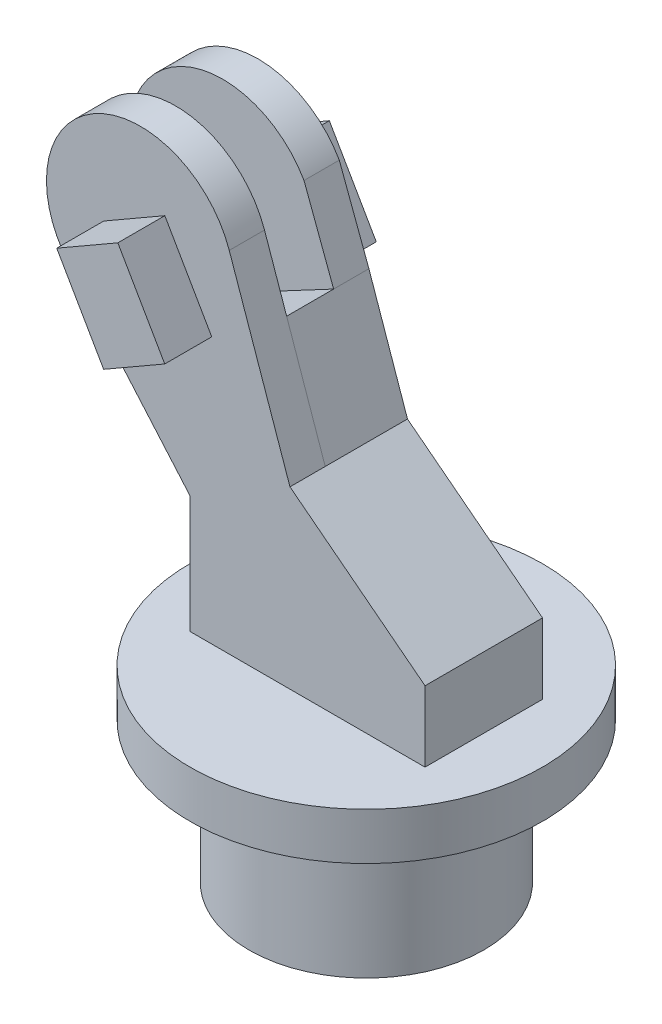
ISO-10303-21;
HEADER;
FILE_DESCRIPTION(('STEP AP214'),'2;1');
FILE_NAME('part.step','',(''),(''),'','','');
FILE_SCHEMA(('AUTOMOTIVE_DESIGN { 1 0 10303 214 1 1 1 1 }'));
ENDSEC;
DATA;
#1=APPLICATION_CONTEXT('core data for automotive mechanical design processes');
#2=APPLICATION_PROTOCOL_DEFINITION('international standard','automotive_design',2000,#1);
#3=PRODUCT_CONTEXT('',#1,'mechanical');
#4=PRODUCT('Part','Part','',(#3));
#5=PRODUCT_RELATED_PRODUCT_CATEGORY('part','',(#4));
#6=PRODUCT_DEFINITION_FORMATION('','',#4);
#7=PRODUCT_DEFINITION_CONTEXT('part definition',#1,'design');
#8=PRODUCT_DEFINITION('design','',#6,#7);
#9=PRODUCT_DEFINITION_SHAPE('','',#8);
#10=(LENGTH_UNIT() NAMED_UNIT(*) SI_UNIT(.MILLI.,.METRE.));
#11=(NAMED_UNIT(*) PLANE_ANGLE_UNIT() SI_UNIT($,.RADIAN.));
#12=(NAMED_UNIT(*) SI_UNIT($,.STERADIAN.) SOLID_ANGLE_UNIT());
#13=UNCERTAINTY_MEASURE_WITH_UNIT(LENGTH_MEASURE(1.E-05),#10,'distance_accuracy_value','');
#14=(GEOMETRIC_REPRESENTATION_CONTEXT(3) GLOBAL_UNCERTAINTY_ASSIGNED_CONTEXT((#13)) GLOBAL_UNIT_ASSIGNED_CONTEXT((#10,
#11,#12)) REPRESENTATION_CONTEXT('',''));
#15=CARTESIAN_POINT('',(0.,0.,0.));
#16=DIRECTION('',(0.,0.,1.));
#17=DIRECTION('',(1.,0.,0.));
#18=AXIS2_PLACEMENT_3D('',#15,#16,#17);
#19=CARTESIAN_POINT('',(0.,0.,38.1));
#20=DIRECTION('',(0.,0.,1.));
#21=DIRECTION('',(1.,0.,0.));
#22=AXIS2_PLACEMENT_3D('',#19,#20,#21);
#23=PLANE('',#22);
#24=DIRECTION('',(0.653512064631514,-0.75691609930101,0.));
#25=VECTOR('',#24,1.);
#26=CARTESIAN_POINT('',(-48.0641723056141,-41.4980161041011,38.1));
#27=LINE('',#26,#25);
#28=CARTESIAN_POINT('',(-178.502675688983,109.579536282436,38.1));
#29=VERTEX_POINT('',#28);
#30=CARTESIAN_POINT('',(-48.0641723056141,-41.4980161041011,38.1));
#31=VERTEX_POINT('',#30);
#32=EDGE_CURVE('E457',#29,#31,#27,.T.);
#33=ORIENTED_EDGE('',*,*,#32,.T.);
#34=DIRECTION('',(0.,-1.,0.));
#35=VECTOR('',#34,1.);
#36=CARTESIAN_POINT('',(-48.0641723056141,-41.4980161041011,38.1));
#37=LINE('',#36,#35);
#38=CARTESIAN_POINT('',(-48.0641723056141,-168.498016104101,38.1));
#39=VERTEX_POINT('',#38);
#40=EDGE_CURVE('E390',#31,#39,#37,.T.);
#41=ORIENTED_EDGE('',*,*,#40,.T.);
#42=DIRECTION('',(1.,0.,0.));
#43=VECTOR('',#42,1.);
#44=CARTESIAN_POINT('',(-48.0641723056141,-168.498016104101,38.1));
#45=LINE('',#44,#43);
#46=CARTESIAN_POINT('',(205.935827694386,-168.498016104101,38.1));
#47=VERTEX_POINT('',#46);
#48=EDGE_CURVE('E415',#39,#47,#45,.T.);
#49=ORIENTED_EDGE('',*,*,#48,.T.);
#50=DIRECTION('',(0.,1.,0.));
#51=VECTOR('',#50,1.);
#52=CARTESIAN_POINT('',(205.935827694386,-168.498016104101,38.1));
#53=LINE('',#52,#51);
#54=CARTESIAN_POINT('',(205.935827694386,-92.2980161041011,38.1));
#55=VERTEX_POINT('',#54);
#56=EDGE_CURVE('E418',#47,#55,#53,.T.);
#57=ORIENTED_EDGE('',*,*,#56,.T.);
#58=DIRECTION('',(-0.790282353034111,0.612742851841511,0.));
#59=VECTOR('',#58,1.);
#60=CARTESIAN_POINT('',(205.935827694386,-92.2980161041011,38.1));
#61=LINE('',#60,#59);
#62=CARTESIAN_POINT('',(59.9704223056142,20.8757861764843,38.1));
#63=VERTEX_POINT('',#62);
#64=EDGE_CURVE('E395',#55,#63,#61,.T.);
#65=ORIENTED_EDGE('',*,*,#64,.T.);
#66=DIRECTION('',(0.32875253821235,-0.944416099301011,0.));
#67=VECTOR('',#66,1.);
#68=CARTESIAN_POINT('',(59.9704223056142,20.8757861764842,38.1));
#69=LINE('',#68,#67);
#70=CARTESIAN_POINT('',(-5.64732431101803,209.377619931372,38.1));
#71=VERTEX_POINT('',#70);
#72=EDGE_CURVE('E453',#71,#63,#69,.T.);
#73=ORIENTED_EDGE('',*,*,#72,.F.);
#74=CARTESIAN_POINT('',(-101.600000000001,175.976362048997,38.1));
#75=DIRECTION('',(0.,0.,1.));
#76=DIRECTION('',(1.,0.,0.));
#77=AXIS2_PLACEMENT_3D('',#74,#75,#76);
#78=CIRCLE('',#77,101.6);
#79=EDGE_CURVE('E445',#71,#29,#78,.T.);
#80=ORIENTED_EDGE('',*,*,#79,.T.);
#81=EDGE_LOOP('',(#33,#41,#49,#57,#65,#73,#80));
#82=FACE_BOUND('',#81,.T.);
#83=DIRECTION('',(-0.49903870108268,0.866579699059302,0.));
#84=VECTOR('',#83,1.);
#85=CARTESIAN_POINT('',(-24.5648809807227,119.003650496163,38.1));
#86=LINE('',#85,#84);
#87=CARTESIAN_POINT('',(-24.5648809807227,119.003650496163,38.1));
#88=VERTEX_POINT('',#87);
#89=CARTESIAN_POINT('',(-75.267213010723,207.048147920588,38.1));
#90=VERTEX_POINT('',#89);
#91=EDGE_CURVE('E269',#88,#90,#86,.T.);
#92=ORIENTED_EDGE('',*,*,#91,.F.);
#93=DIRECTION('',(0.866579699059302,0.499038701082681,0.));
#94=VECTOR('',#93,1.);
#95=CARTESIAN_POINT('',(-24.5648809807227,119.003650496163,38.1));
#96=LINE('',#95,#94);
#97=CARTESIAN_POINT('',(-90.5982540490415,80.9769014736625,38.1));
#98=VERTEX_POINT('',#97);
#99=EDGE_CURVE('E210',#98,#88,#96,.T.);
#100=ORIENTED_EDGE('',*,*,#99,.F.);
#101=DIRECTION('',(0.49903870108268,-0.866579699059302,0.));
#102=VECTOR('',#101,1.);
#103=CARTESIAN_POINT('',(-90.5982540490415,80.9769014736625,38.1));
#104=LINE('',#103,#102);
#105=CARTESIAN_POINT('',(-141.300586079042,169.021398898088,38.1));
#106=VERTEX_POINT('',#105);
#107=EDGE_CURVE('E256',#106,#98,#104,.T.);
#108=ORIENTED_EDGE('',*,*,#107,.F.);
#109=DIRECTION('',(-0.866579699059302,-0.499038701082681,0.));
#110=VECTOR('',#109,1.);
#111=CARTESIAN_POINT('',(-75.267213010723,207.048147920588,38.1));
#112=LINE('',#111,#110);
#113=EDGE_CURVE('E272',#90,#106,#112,.T.);
#114=ORIENTED_EDGE('',*,*,#113,.F.);
#115=EDGE_LOOP('',(#92,#100,#108,#114));
#116=FACE_BOUND('',#115,.T.);
#117=ADVANCED_FACE('F41',(#82,#116),#23,.T.);
#118=CARTESIAN_POINT('',(18.2632612343824,140.689049325709,-88.9));
#119=DIRECTION('',(0.46960220053166,-0.882878119139795,0.));
#120=DIRECTION('',(0.882878119139795,0.46960220053166,0.));
#121=AXIS2_PLACEMENT_3D('',#118,#119,#120);
#122=PLANE('',#121);
#123=DIRECTION('',(-0.882878119139795,-0.46960220053166,0.));
#124=VECTOR('',#123,1.);
#125=CARTESIAN_POINT('',(18.2632612343824,140.689049325709,-50.8));
#126=LINE('',#125,#124);
#127=CARTESIAN_POINT('',(18.2632612343824,140.689049325709,-50.8));
#128=VERTEX_POINT('',#127);
#129=CARTESIAN_POINT('',(-134.985164693071,59.1763280526264,-50.8));
#130=VERTEX_POINT('',#129);
#131=EDGE_CURVE('E323',#128,#130,#126,.T.);
#132=ORIENTED_EDGE('',*,*,#131,.T.);
#133=DIRECTION('',(0.,0.,1.));
#134=VECTOR('',#133,1.);
#135=CARTESIAN_POINT('',(-134.985164693071,59.1763280526264,-88.9));
#136=LINE('',#135,#134);
#137=CARTESIAN_POINT('',(-134.985164693071,59.1763280526264,0.));
#138=VERTEX_POINT('',#137);
#139=EDGE_CURVE('E382',#130,#138,#136,.T.);
#140=ORIENTED_EDGE('',*,*,#139,.T.);
#141=DIRECTION('',(0.882878119139795,0.46960220053166,0.));
#142=VECTOR('',#141,1.);
#143=CARTESIAN_POINT('',(18.2632612343824,140.689049325709,0.));
#144=LINE('',#143,#142);
#145=CARTESIAN_POINT('',(18.2632612220155,140.689049361235,0.));
#146=VERTEX_POINT('',#145);
#147=EDGE_CURVE('E368',#138,#146,#144,.T.);
#148=ORIENTED_EDGE('',*,*,#147,.T.);
#149=DIRECTION('',(0.,0.,1.));
#150=VECTOR('',#149,1.);
#151=CARTESIAN_POINT('',(18.2632612343824,140.689049325709,-88.9));
#152=LINE('',#151,#150);
#153=EDGE_CURVE('E377',#128,#146,#152,.T.);
#154=ORIENTED_EDGE('',*,*,#153,.F.);
#155=EDGE_LOOP('',(#132,#140,#148,#154));
#156=FACE_BOUND('',#155,.T.);
#157=ADVANCED_FACE('F533',(#156),#122,.F.);
#158=CARTESIAN_POINT('',(0.,0.,0.));
#159=DIRECTION('',(0.,0.,1.));
#160=DIRECTION('',(1.,0.,0.));
#161=AXIS2_PLACEMENT_3D('',#158,#159,#160);
#162=PLANE('',#161);
#163=CARTESIAN_POINT('',(0.,0.,0.));
#164=DIRECTION('',(0.,0.,-1.));
#165=DIRECTION('',(-1.,0.,0.));
#166=AXIS2_PLACEMENT_3D('',#163,#164,#165);
#167=CIRCLE('',#166,63.5);
#168=CARTESIAN_POINT('',(-48.0641723056141,-41.4980161041011,0.));
#169=VERTEX_POINT('',#168);
#170=CARTESIAN_POINT('',(-51.7738505308691,-36.7657231835201,0.));
#171=VERTEX_POINT('',#170);
#172=EDGE_CURVE('E345',#169,#171,#167,.T.);
#173=ORIENTED_EDGE('',*,*,#172,.F.);
#174=DIRECTION('',(0.653512064631514,-0.75691609930101,0.));
#175=VECTOR('',#174,1.);
#176=CARTESIAN_POINT('',(-48.0641723056141,-41.4980161041011,0.));
#177=LINE('',#176,#175);
#178=EDGE_CURVE('E467',#138,#169,#177,.T.);
#179=ORIENTED_EDGE('',*,*,#178,.F.);
#180=DIRECTION('',(-0.655207198127574,0.755449222331862,0.));
#181=VECTOR('',#180,1.);
#182=CARTESIAN_POINT('',(-51.7738505308691,-36.7657231835201,0.));
#183=LINE('',#182,#181);
#184=EDGE_CURVE('E364',#171,#138,#183,.T.);
#185=ORIENTED_EDGE('',*,*,#184,.F.);
#186=EDGE_LOOP('',(#173,#179,#185));
#187=FACE_BOUND('',#186,.T.);
#188=ADVANCED_FACE('F535',(#187),#162,.F.);
#189=CARTESIAN_POINT('',(-101.600000000001,175.976362048997,0.));
#190=DIRECTION('',(0.,0.,1.));
#191=DIRECTION('',(1.,0.,0.));
#192=AXIS2_PLACEMENT_3D('',#189,#190,#191);
#193=CIRCLE('',#192,12.7);
#194=CARTESIAN_POINT('',(-88.9000000000007,175.976362048997,0.));
#195=VERTEX_POINT('',#194);
#196=EDGE_CURVE('E11',#195,#195,#193,.F.);
#197=ORIENTED_EDGE('',*,*,#196,.F.);
#198=EDGE_LOOP('',(#197));
#199=FACE_BOUND('',#198,.T.);
#200=ORIENTED_EDGE('',*,*,#147,.F.);
#201=CARTESIAN_POINT('',(-178.502675688983,109.579536282436,0.));
#202=VERTEX_POINT('',#201);
#203=EDGE_CURVE('E458',#202,#138,#177,.T.);
#204=ORIENTED_EDGE('',*,*,#203,.F.);
#205=CARTESIAN_POINT('',(-101.600000000001,175.976362048997,0.));
#206=DIRECTION('',(0.,0.,1.));
#207=DIRECTION('',(1.,0.,0.));
#208=AXIS2_PLACEMENT_3D('',#205,#206,#207);
#209=CIRCLE('',#208,101.6);
#210=CARTESIAN_POINT('',(-5.64732431101803,209.377619931372,0.));
#211=VERTEX_POINT('',#210);
#212=EDGE_CURVE('E446',#211,#202,#209,.T.);
#213=ORIENTED_EDGE('',*,*,#212,.F.);
#214=DIRECTION('',(0.32875253821235,-0.944416099301011,0.));
#215=VECTOR('',#214,1.);
#216=CARTESIAN_POINT('',(59.9704223056142,20.8757861764842,0.));
#217=LINE('',#216,#215);
#218=EDGE_CURVE('E463',#211,#146,#217,.T.);
#219=ORIENTED_EDGE('',*,*,#218,.T.);
#220=EDGE_LOOP('',(#200,#204,#213,#219));
#221=FACE_BOUND('',#220,.T.);
#222=ADVANCED_FACE('F530',(#199,#221),#162,.F.);
#223=DIRECTION('',(0.328751469637615,-0.944416471272663,0.));
#224=VECTOR('',#223,1.);
#225=CARTESIAN_POINT('',(60.0146978783595,20.7481574740804,0.));
#226=LINE('',#225,#224);
#227=CARTESIAN_POINT('',(60.0146978783595,20.7481574740804,0.));
#228=VERTEX_POINT('',#227);
#229=EDGE_CURVE('E352',#146,#228,#226,.T.);
#230=ORIENTED_EDGE('',*,*,#229,.F.);
#231=CARTESIAN_POINT('',(59.9704223056142,20.8757861764843,0.));
#232=VERTEX_POINT('',#231);
#233=EDGE_CURVE('E449',#146,#232,#217,.T.);
#234=ORIENTED_EDGE('',*,*,#233,.T.);
#235=CARTESIAN_POINT('',(0.,0.,0.));
#236=DIRECTION('',(0.,0.,1.));
#237=DIRECTION('',(1.,0.,0.));
#238=AXIS2_PLACEMENT_3D('',#235,#236,#237);
#239=CIRCLE('',#238,63.5);
#240=EDGE_CURVE('E428',#228,#232,#239,.T.);
#241=ORIENTED_EDGE('',*,*,#240,.F.);
#242=EDGE_LOOP('',(#230,#234,#241));
#243=FACE_BOUND('',#242,.T.);
#244=ADVANCED_FACE('F523',(#243),#162,.F.);
#245=CARTESIAN_POINT('',(0.,0.,-88.9));
#246=DIRECTION('',(0.,0.,1.));
#247=DIRECTION('',(1.,0.,0.));
#248=AXIS2_PLACEMENT_3D('',#245,#246,#247);
#249=CYLINDRICAL_SURFACE('',#248,63.5);
#250=CARTESIAN_POINT('',(0.,0.,-88.9));
#251=DIRECTION('',(0.,0.,-1.));
#252=DIRECTION('',(1.,0.,0.));
#253=AXIS2_PLACEMENT_3D('',#250,#251,#252);
#254=CIRCLE('',#253,63.5);
#255=CARTESIAN_POINT('',(59.9704223056142,20.8757861764843,-88.9));
#256=VERTEX_POINT('',#255);
#257=CARTESIAN_POINT('',(60.0146978783592,20.7481574740811,-88.9));
#258=VERTEX_POINT('',#257);
#259=EDGE_CURVE('E391',#256,#258,#254,.T.);
#260=ORIENTED_EDGE('',*,*,#259,.T.);
#261=DIRECTION('',(0.,0.,1.));
#262=VECTOR('',#261,1.);
#263=CARTESIAN_POINT('',(60.0146978783595,20.7481574740804,-88.9));
#264=LINE('',#263,#262);
#265=EDGE_CURVE('E360',#258,#228,#264,.T.);
#266=ORIENTED_EDGE('',*,*,#265,.T.);
#267=ORIENTED_EDGE('',*,*,#240,.T.);
#268=DIRECTION('',(0.,0.,1.));
#269=VECTOR('',#268,1.);
#270=CARTESIAN_POINT('',(59.9704223056142,20.8757861764843,-88.9));
#271=LINE('',#270,#269);
#272=EDGE_CURVE('E424',#256,#232,#271,.T.);
#273=ORIENTED_EDGE('',*,*,#272,.F.);
#274=EDGE_LOOP('',(#260,#266,#267,#273));
#275=FACE_BOUND('',#274,.T.);
#276=ADVANCED_FACE('F571',(#275),#249,.F.);
#277=CARTESIAN_POINT('',(59.9704223056142,20.8757861764842,38.1));
#278=DIRECTION('',(0.944416099301011,0.32875253821235,0.));
#279=DIRECTION('',(-0.32875253821235,0.944416099301011,0.));
#280=AXIS2_PLACEMENT_3D('',#277,#278,#279);
#281=PLANE('',#280);
#282=ORIENTED_EDGE('',*,*,#218,.F.);
#283=DIRECTION('',(0.,0.,-1.));
#284=VECTOR('',#283,1.);
#285=CARTESIAN_POINT('',(-5.64732431101803,209.377619931372,38.1));
#286=LINE('',#285,#284);
#287=EDGE_CURVE('E478',#71,#211,#286,.T.);
#288=ORIENTED_EDGE('',*,*,#287,.F.);
#289=ORIENTED_EDGE('',*,*,#72,.T.);
#290=DIRECTION('',(0.,0.,-1.));
#291=VECTOR('',#290,1.);
#292=CARTESIAN_POINT('',(59.9704223056142,20.8757861764843,38.1));
#293=LINE('',#292,#291);
#294=EDGE_CURVE('E306',#63,#232,#293,.T.);
#295=ORIENTED_EDGE('',*,*,#294,.T.);
#296=ORIENTED_EDGE('',*,*,#233,.F.);
#297=EDGE_LOOP('',(#282,#288,#289,#295,#296));
#298=FACE_BOUND('',#297,.T.);
#299=ADVANCED_FACE('F43',(#298),#281,.T.);
#300=CARTESIAN_POINT('',(-48.0641723056141,-41.4980161041011,38.1));
#301=DIRECTION('',(0.75691609930101,0.653512064631514,0.));
#302=DIRECTION('',(-0.653512064631514,0.75691609930101,0.));
#303=AXIS2_PLACEMENT_3D('',#300,#301,#302);
#304=PLANE('',#303);
#305=ORIENTED_EDGE('',*,*,#203,.T.);
#306=ORIENTED_EDGE('',*,*,#178,.T.);
#307=DIRECTION('',(0.,0.,-1.));
#308=VECTOR('',#307,1.);
#309=CARTESIAN_POINT('',(-48.0641723056141,-41.4980161041011,38.1));
#310=LINE('',#309,#308);
#311=EDGE_CURVE('E462',#31,#169,#310,.T.);
#312=ORIENTED_EDGE('',*,*,#311,.F.);
#313=ORIENTED_EDGE('',*,*,#32,.F.);
#314=DIRECTION('',(0.,0.,-1.));
#315=VECTOR('',#314,1.);
#316=CARTESIAN_POINT('',(-178.502675688983,109.579536282436,38.1));
#317=LINE('',#316,#315);
#318=EDGE_CURVE('E474',#29,#202,#317,.T.);
#319=ORIENTED_EDGE('',*,*,#318,.T.);
#320=EDGE_LOOP('',(#305,#306,#312,#313,#319));
#321=FACE_BOUND('',#320,.T.);
#322=ADVANCED_FACE('F576',(#321),#304,.F.);
#323=CARTESIAN_POINT('',(-101.600000000001,175.976362048997,0.));
#324=DIRECTION('',(0.,0.,1.));
#325=DIRECTION('',(1.,0.,0.));
#326=AXIS2_PLACEMENT_3D('',#323,#324,#325);
#327=CYLINDRICAL_SURFACE('',#326,101.6);
#328=ORIENTED_EDGE('',*,*,#287,.T.);
#329=ORIENTED_EDGE('',*,*,#212,.T.);
#330=ORIENTED_EDGE('',*,*,#318,.F.);
#331=ORIENTED_EDGE('',*,*,#79,.F.);
#332=EDGE_LOOP('',(#328,#329,#330,#331));
#333=FACE_BOUND('',#332,.T.);
#334=ADVANCED_FACE('F563',(#333),#327,.T.);
#335=CARTESIAN_POINT('',(205.935827694386,-92.2980161041011,-88.9));
#336=DIRECTION('',(0.612742851841511,0.790282353034111,0.));
#337=DIRECTION('',(-0.790282353034111,0.612742851841511,0.));
#338=AXIS2_PLACEMENT_3D('',#335,#336,#337);
#339=PLANE('',#338);
#340=ORIENTED_EDGE('',*,*,#64,.F.);
#341=DIRECTION('',(0.,0.,1.));
#342=VECTOR('',#341,1.);
#343=CARTESIAN_POINT('',(205.935827694386,-92.2980161041011,-88.9));
#344=LINE('',#343,#342);
#345=CARTESIAN_POINT('',(205.935827694386,-92.2980161041011,-88.9));
#346=VERTEX_POINT('',#345);
#347=EDGE_CURVE('E429',#346,#55,#344,.T.);
#348=ORIENTED_EDGE('',*,*,#347,.F.);
#349=DIRECTION('',(-0.790282353034111,0.612742851841511,0.));
#350=VECTOR('',#349,1.);
#351=CARTESIAN_POINT('',(205.935827694386,-92.2980161041011,-88.9));
#352=LINE('',#351,#350);
#353=EDGE_CURVE('E407',#346,#256,#352,.T.);
#354=ORIENTED_EDGE('',*,*,#353,.T.);
#355=ORIENTED_EDGE('',*,*,#272,.T.);
#356=ORIENTED_EDGE('',*,*,#294,.F.);
#357=EDGE_LOOP('',(#340,#348,#354,#355,#356));
#358=FACE_BOUND('',#357,.T.);
#359=ADVANCED_FACE('F559',(#358),#339,.T.);
#360=CARTESIAN_POINT('',(205.935827694386,-168.498016104101,-88.9));
#361=DIRECTION('',(1.,0.,0.));
#362=DIRECTION('',(0.,0.,-1.));
#363=AXIS2_PLACEMENT_3D('',#360,#361,#362);
#364=PLANE('',#363);
#365=ORIENTED_EDGE('',*,*,#56,.F.);
#366=DIRECTION('',(0.,0.,1.));
#367=VECTOR('',#366,1.);
#368=CARTESIAN_POINT('',(205.935827694386,-168.498016104101,-88.9));
#369=LINE('',#368,#367);
#370=CARTESIAN_POINT('',(205.935827694386,-168.498016104101,-88.9));
#371=VERTEX_POINT('',#370);
#372=EDGE_CURVE('E432',#371,#47,#369,.T.);
#373=ORIENTED_EDGE('',*,*,#372,.F.);
#374=DIRECTION('',(0.,1.,0.));
#375=VECTOR('',#374,1.);
#376=CARTESIAN_POINT('',(205.935827694386,-168.498016104101,-88.9));
#377=LINE('',#376,#375);
#378=EDGE_CURVE('E403',#371,#346,#377,.T.);
#379=ORIENTED_EDGE('',*,*,#378,.T.);
#380=ORIENTED_EDGE('',*,*,#347,.T.);
#381=EDGE_LOOP('',(#365,#373,#379,#380));
#382=FACE_BOUND('',#381,.T.);
#383=ADVANCED_FACE('F562',(#382),#364,.T.);
#384=CARTESIAN_POINT('',(-48.0641723056141,-41.4980161041011,-88.9));
#385=DIRECTION('',(-1.,0.,0.));
#386=DIRECTION('',(0.,-1.,0.));
#387=AXIS2_PLACEMENT_3D('',#384,#385,#386);
#388=PLANE('',#387);
#389=ORIENTED_EDGE('',*,*,#40,.F.);
#390=ORIENTED_EDGE('',*,*,#311,.T.);
#391=DIRECTION('',(0.,0.,1.));
#392=VECTOR('',#391,1.);
#393=CARTESIAN_POINT('',(-48.0641723056141,-41.4980161041011,-88.9));
#394=LINE('',#393,#392);
#395=CARTESIAN_POINT('',(-48.0641723056141,-41.4980161041011,-88.9));
#396=VERTEX_POINT('',#395);
#397=EDGE_CURVE('E411',#396,#169,#394,.T.);
#398=ORIENTED_EDGE('',*,*,#397,.F.);
#399=DIRECTION('',(0.,-1.,0.));
#400=VECTOR('',#399,1.);
#401=CARTESIAN_POINT('',(-48.0641723056141,-41.4980161041011,-88.9));
#402=LINE('',#401,#400);
#403=CARTESIAN_POINT('',(-48.0641723056141,-168.498016104101,-88.9));
#404=VERTEX_POINT('',#403);
#405=EDGE_CURVE('E394',#396,#404,#402,.T.);
#406=ORIENTED_EDGE('',*,*,#405,.T.);
#407=DIRECTION('',(0.,0.,1.));
#408=VECTOR('',#407,1.);
#409=CARTESIAN_POINT('',(-48.0641723056141,-168.498016104101,-88.9));
#410=LINE('',#409,#408);
#411=EDGE_CURVE('E436',#404,#39,#410,.T.);
#412=ORIENTED_EDGE('',*,*,#411,.T.);
#413=EDGE_LOOP('',(#389,#390,#398,#406,#412));
#414=FACE_BOUND('',#413,.T.);
#415=ADVANCED_FACE('F557',(#414),#388,.T.);
#416=CARTESIAN_POINT('',(0.,0.,-88.9));
#417=DIRECTION('',(0.,0.,1.));
#418=DIRECTION('',(1.,0.,0.));
#419=AXIS2_PLACEMENT_3D('',#416,#417,#418);
#420=PLANE('',#419);
#421=DIRECTION('',(0.49903870108268,-0.866579699059302,0.));
#422=VECTOR('',#421,1.);
#423=CARTESIAN_POINT('',(-90.5982540490415,80.9769014736625,-88.9));
#424=LINE('',#423,#422);
#425=CARTESIAN_POINT('',(-141.300586079042,169.021398898088,-88.9));
#426=VERTEX_POINT('',#425);
#427=CARTESIAN_POINT('',(-90.5982540490415,80.9769014736625,-88.9));
#428=VERTEX_POINT('',#427);
#429=EDGE_CURVE('E236',#426,#428,#424,.T.);
#430=ORIENTED_EDGE('',*,*,#429,.T.);
#431=DIRECTION('',(0.866579699059302,0.499038701082681,0.));
#432=VECTOR('',#431,1.);
#433=CARTESIAN_POINT('',(-24.5648809807227,119.003650496163,-88.9));
#434=LINE('',#433,#432);
#435=CARTESIAN_POINT('',(-24.5648809807227,119.003650496163,-88.9));
#436=VERTEX_POINT('',#435);
#437=EDGE_CURVE('E204',#428,#436,#434,.T.);
#438=ORIENTED_EDGE('',*,*,#437,.T.);
#439=DIRECTION('',(-0.49903870108268,0.866579699059302,0.));
#440=VECTOR('',#439,1.);
#441=CARTESIAN_POINT('',(-24.5648809807227,119.003650496163,-88.9));
#442=LINE('',#441,#440);
#443=CARTESIAN_POINT('',(-75.267213010723,207.048147920588,-88.9));
#444=VERTEX_POINT('',#443);
#445=EDGE_CURVE('E222',#436,#444,#442,.T.);
#446=ORIENTED_EDGE('',*,*,#445,.T.);
#447=DIRECTION('',(-0.866579699059302,-0.499038701082681,0.));
#448=VECTOR('',#447,1.);
#449=CARTESIAN_POINT('',(-75.267213010723,207.048147920588,-88.9));
#450=LINE('',#449,#448);
#451=EDGE_CURVE('E57',#444,#426,#450,.T.);
#452=ORIENTED_EDGE('',*,*,#451,.T.);
#453=EDGE_LOOP('',(#430,#438,#446,#452));
#454=FACE_BOUND('',#453,.T.);
#455=ORIENTED_EDGE('',*,*,#259,.F.);
#456=ORIENTED_EDGE('',*,*,#353,.F.);
#457=ORIENTED_EDGE('',*,*,#378,.F.);
#458=DIRECTION('',(1.,0.,0.));
#459=VECTOR('',#458,1.);
#460=CARTESIAN_POINT('',(-48.0641723056141,-168.498016104101,-88.9));
#461=LINE('',#460,#459);
#462=EDGE_CURVE('E399',#404,#371,#461,.T.);
#463=ORIENTED_EDGE('',*,*,#462,.F.);
#464=ORIENTED_EDGE('',*,*,#405,.F.);
#465=CARTESIAN_POINT('',(0.,0.,-88.9));
#466=DIRECTION('',(0.,0.,-1.));
#467=DIRECTION('',(-1.,0.,0.));
#468=AXIS2_PLACEMENT_3D('',#465,#466,#467);
#469=CIRCLE('',#468,63.5);
#470=CARTESIAN_POINT('',(-51.7738505308691,-36.7657231835201,-88.9));
#471=VERTEX_POINT('',#470);
#472=EDGE_CURVE('E348',#396,#471,#469,.T.);
#473=ORIENTED_EDGE('',*,*,#472,.T.);
#474=DIRECTION('',(-0.655207198127574,0.755449222331862,0.));
#475=VECTOR('',#474,1.);
#476=CARTESIAN_POINT('',(-51.7738505308691,-36.7657231835201,-88.9));
#477=LINE('',#476,#475);
#478=CARTESIAN_POINT('',(-134.985164693071,59.1763280526264,-88.9));
#479=VERTEX_POINT('',#478);
#480=EDGE_CURVE('E351',#471,#479,#477,.T.);
#481=ORIENTED_EDGE('',*,*,#480,.T.);
#482=DIRECTION('',(-0.633930637160239,0.773389906366519,0.));
#483=VECTOR('',#482,1.);
#484=CARTESIAN_POINT('',(-134.985164693071,59.1763280526264,-88.9));
#485=LINE('',#484,#483);
#486=CARTESIAN_POINT('',(-189.462961162212,125.638769588913,-88.9));
#487=VERTEX_POINT('',#486);
#488=EDGE_CURVE('E320',#479,#487,#485,.T.);
#489=ORIENTED_EDGE('',*,*,#488,.T.);
#490=CARTESIAN_POINT('',(-101.600000000001,175.976362048997,-88.9));
#491=DIRECTION('',(0.,0.,-1.));
#492=DIRECTION('',(-1.,0.,0.));
#493=AXIS2_PLACEMENT_3D('',#490,#491,#492);
#494=CIRCLE('',#493,101.260916245459);
#495=CARTESIAN_POINT('',(-13.737038837789,226.313954509082,-88.9));
#496=VERTEX_POINT('',#495);
#497=EDGE_CURVE('E311',#487,#496,#494,.T.);
#498=ORIENTED_EDGE('',*,*,#497,.T.);
#499=DIRECTION('',(0.350077418087642,-0.936720770211214,0.));
#500=VECTOR('',#499,1.);
#501=CARTESIAN_POINT('',(-13.737038837789,226.313954509082,-88.9));
#502=LINE('',#501,#500);
#503=CARTESIAN_POINT('',(18.2632612343824,140.689049325709,-88.9));
#504=VERTEX_POINT('',#503);
#505=EDGE_CURVE('E335',#496,#504,#502,.T.);
#506=ORIENTED_EDGE('',*,*,#505,.T.);
#507=DIRECTION('',(0.328751469637615,-0.944416471272663,0.));
#508=VECTOR('',#507,1.);
#509=CARTESIAN_POINT('',(60.0146978783595,20.7481574740804,-88.9));
#510=LINE('',#509,#508);
#511=EDGE_CURVE('E356',#504,#258,#510,.T.);
#512=ORIENTED_EDGE('',*,*,#511,.T.);
#513=EDGE_LOOP('',(#455,#456,#457,#463,#464,#473,#481,#489,#498,#506,#512));
#514=FACE_BOUND('',#513,.T.);
#515=ADVANCED_FACE('F553',(#454,#514),#420,.F.);
#516=CARTESIAN_POINT('',(0.,0.,-88.9));
#517=DIRECTION('',(0.,0.,1.));
#518=DIRECTION('',(1.,0.,0.));
#519=AXIS2_PLACEMENT_3D('',#516,#517,#518);
#520=CYLINDRICAL_SURFACE('',#519,63.5);
#521=ORIENTED_EDGE('',*,*,#397,.T.);
#522=ORIENTED_EDGE('',*,*,#172,.T.);
#523=DIRECTION('',(0.,0.,1.));
#524=VECTOR('',#523,1.);
#525=CARTESIAN_POINT('',(-51.7738505308691,-36.7657231835201,-88.9));
#526=LINE('',#525,#524);
#527=EDGE_CURVE('E386',#471,#171,#526,.T.);
#528=ORIENTED_EDGE('',*,*,#527,.F.);
#529=ORIENTED_EDGE('',*,*,#472,.F.);
#530=EDGE_LOOP('',(#521,#522,#528,#529));
#531=FACE_BOUND('',#530,.T.);
#532=ADVANCED_FACE('F550',(#531),#520,.T.);
#533=CARTESIAN_POINT('',(-51.7738505308691,-36.7657231835201,-88.9));
#534=DIRECTION('',(0.755449222331862,0.655207198127574,0.));
#535=DIRECTION('',(-0.655207198127574,0.755449222331862,0.));
#536=AXIS2_PLACEMENT_3D('',#533,#534,#535);
#537=PLANE('',#536);
#538=ORIENTED_EDGE('',*,*,#184,.T.);
#539=ORIENTED_EDGE('',*,*,#139,.F.);
#540=EDGE_CURVE('E383',#479,#130,#136,.T.);
#541=ORIENTED_EDGE('',*,*,#540,.F.);
#542=ORIENTED_EDGE('',*,*,#480,.F.);
#543=ORIENTED_EDGE('',*,*,#527,.T.);
#544=EDGE_LOOP('',(#538,#539,#541,#542,#543));
#545=FACE_BOUND('',#544,.T.);
#546=ADVANCED_FACE('F508',(#545),#537,.F.);
#547=CARTESIAN_POINT('',(60.0146978783595,20.7481574740804,-88.9));
#548=DIRECTION('',(-0.944416471272663,-0.328751469637615,0.));
#549=DIRECTION('',(0.328751469637615,-0.944416471272663,0.));
#550=AXIS2_PLACEMENT_3D('',#547,#548,#549);
#551=PLANE('',#550);
#552=ORIENTED_EDGE('',*,*,#229,.T.);
#553=ORIENTED_EDGE('',*,*,#265,.F.);
#554=ORIENTED_EDGE('',*,*,#511,.F.);
#555=EDGE_CURVE('E378',#504,#128,#152,.T.);
#556=ORIENTED_EDGE('',*,*,#555,.T.);
#557=ORIENTED_EDGE('',*,*,#153,.T.);
#558=EDGE_LOOP('',(#552,#553,#554,#556,#557));
#559=FACE_BOUND('',#558,.T.);
#560=ADVANCED_FACE('F517',(#559),#551,.F.);
#561=CARTESIAN_POINT('',(-101.600000000001,175.976362048997,-50.8));
#562=DIRECTION('',(0.,0.,-1.));
#563=DIRECTION('',(-1.,0.,0.));
#564=AXIS2_PLACEMENT_3D('',#561,#562,#563);
#565=CYLINDRICAL_SURFACE('',#564,101.260916245459);
#566=ORIENTED_EDGE('',*,*,#497,.F.);
#567=DIRECTION('',(0.,0.,-1.));
#568=VECTOR('',#567,1.);
#569=CARTESIAN_POINT('',(-189.462961162212,125.638769588913,-50.8));
#570=LINE('',#569,#568);
#571=CARTESIAN_POINT('',(-189.462961162212,125.638769588913,-50.8));
#572=VERTEX_POINT('',#571);
#573=EDGE_CURVE('E342',#572,#487,#570,.T.);
#574=ORIENTED_EDGE('',*,*,#573,.F.);
#575=CARTESIAN_POINT('',(-101.600000000001,175.976362048997,-50.8));
#576=DIRECTION('',(0.,0.,-1.));
#577=DIRECTION('',(-1.,0.,0.));
#578=AXIS2_PLACEMENT_3D('',#575,#576,#577);
#579=CIRCLE('',#578,101.260916245459);
#580=CARTESIAN_POINT('',(-13.737038837789,226.313954509082,-50.8));
#581=VERTEX_POINT('',#580);
#582=EDGE_CURVE('E315',#572,#581,#579,.T.);
#583=ORIENTED_EDGE('',*,*,#582,.T.);
#584=DIRECTION('',(0.,0.,-1.));
#585=VECTOR('',#584,1.);
#586=CARTESIAN_POINT('',(-13.737038837789,226.313954509082,-50.8));
#587=LINE('',#586,#585);
#588=EDGE_CURVE('E331',#581,#496,#587,.T.);
#589=ORIENTED_EDGE('',*,*,#588,.T.);
#590=EDGE_LOOP('',(#566,#574,#583,#589));
#591=FACE_BOUND('',#590,.T.);
#592=ADVANCED_FACE('F596',(#591),#565,.T.);
#593=CARTESIAN_POINT('',(-134.985164693071,59.1763280526264,-50.8));
#594=DIRECTION('',(-0.773389906366519,-0.633930637160239,0.));
#595=DIRECTION('',(0.633930637160239,-0.773389906366519,0.));
#596=AXIS2_PLACEMENT_3D('',#593,#594,#595);
#597=PLANE('',#596);
#598=ORIENTED_EDGE('',*,*,#488,.F.);
#599=ORIENTED_EDGE('',*,*,#540,.T.);
#600=DIRECTION('',(-0.633930637160239,0.773389906366519,0.));
#601=VECTOR('',#600,1.);
#602=CARTESIAN_POINT('',(-134.985164693071,59.1763280526264,-50.8));
#603=LINE('',#602,#601);
#604=EDGE_CURVE('E327',#130,#572,#603,.T.);
#605=ORIENTED_EDGE('',*,*,#604,.T.);
#606=ORIENTED_EDGE('',*,*,#573,.T.);
#607=EDGE_LOOP('',(#598,#599,#605,#606));
#608=FACE_BOUND('',#607,.T.);
#609=ADVANCED_FACE('F502',(#608),#597,.T.);
#610=CARTESIAN_POINT('',(-13.737038837789,226.313954509082,-50.8));
#611=DIRECTION('',(0.936720770211214,0.350077418087642,0.));
#612=DIRECTION('',(-0.350077418087642,0.936720770211214,0.));
#613=AXIS2_PLACEMENT_3D('',#610,#611,#612);
#614=PLANE('',#613);
#615=ORIENTED_EDGE('',*,*,#505,.F.);
#616=ORIENTED_EDGE('',*,*,#588,.F.);
#617=DIRECTION('',(0.350077418087642,-0.936720770211214,0.));
#618=VECTOR('',#617,1.);
#619=CARTESIAN_POINT('',(-13.737038837789,226.313954509082,-50.8));
#620=LINE('',#619,#618);
#621=EDGE_CURVE('E319',#581,#128,#620,.T.);
#622=ORIENTED_EDGE('',*,*,#621,.T.);
#623=ORIENTED_EDGE('',*,*,#555,.F.);
#624=EDGE_LOOP('',(#615,#616,#622,#623));
#625=FACE_BOUND('',#624,.T.);
#626=ADVANCED_FACE('F494',(#625),#614,.T.);
#627=CARTESIAN_POINT('',(-101.600000000001,175.976362048997,-50.8));
#628=DIRECTION('',(0.,0.,-1.));
#629=DIRECTION('',(-1.,0.,0.));
#630=AXIS2_PLACEMENT_3D('',#627,#628,#629);
#631=PLANE('',#630);
#632=CARTESIAN_POINT('',(-101.600000000001,175.976362048997,-50.8));
#633=DIRECTION('',(0.,0.,-1.));
#634=DIRECTION('',(-1.,0.,0.));
#635=AXIS2_PLACEMENT_3D('',#632,#633,#634);
#636=CIRCLE('',#635,12.7);
#637=CARTESIAN_POINT('',(-114.300000000001,175.976362048997,-50.8));
#638=VERTEX_POINT('',#637);
#639=EDGE_CURVE('E50',#638,#638,#636,.F.);
#640=ORIENTED_EDGE('',*,*,#639,.F.);
#641=EDGE_LOOP('',(#640));
#642=FACE_BOUND('',#641,.T.);
#643=ORIENTED_EDGE('',*,*,#582,.F.);
#644=ORIENTED_EDGE('',*,*,#604,.F.);
#645=ORIENTED_EDGE('',*,*,#131,.F.);
#646=ORIENTED_EDGE('',*,*,#621,.F.);
#647=EDGE_LOOP('',(#643,#644,#645,#646));
#648=FACE_BOUND('',#647,.T.);
#649=ADVANCED_FACE('F490',(#642,#648),#631,.F.);
#650=CARTESIAN_POINT('',(78.9358276943859,-219.298016104101,-25.4));
#651=DIRECTION('',(0.,1.,0.));
#652=DIRECTION('',(0.,0.,1.));
#653=AXIS2_PLACEMENT_3D('',#650,#651,#652);
#654=CYLINDRICAL_SURFACE('',#653,190.5);
#655=CARTESIAN_POINT('',(78.9358276943859,-219.298016104101,-25.4));
#656=DIRECTION('',(0.,-1.,0.));
#657=DIRECTION('',(0.,0.,-1.));
#658=AXIS2_PLACEMENT_3D('',#655,#656,#657);
#659=CIRCLE('',#658,190.5);
#660=CARTESIAN_POINT('',(78.9358276943859,-219.298016104101,-215.9));
#661=VERTEX_POINT('',#660);
#662=EDGE_CURVE('E307',#661,#661,#659,.T.);
#663=ORIENTED_EDGE('',*,*,#662,.F.);
#664=EDGE_LOOP('',(#663));
#665=FACE_BOUND('',#664,.T.);
#666=CARTESIAN_POINT('',(78.9358276943859,-168.498016104101,-25.4));
#667=DIRECTION('',(0.,-1.,0.));
#668=DIRECTION('',(0.,0.,-1.));
#669=AXIS2_PLACEMENT_3D('',#666,#667,#668);
#670=CIRCLE('',#669,190.5);
#671=CARTESIAN_POINT('',(78.9358276943859,-168.498016104101,-215.9));
#672=VERTEX_POINT('',#671);
#673=EDGE_CURVE('E301',#672,#672,#670,.T.);
#674=ORIENTED_EDGE('',*,*,#673,.T.);
#675=EDGE_LOOP('',(#674));
#676=FACE_BOUND('',#675,.T.);
#677=ADVANCED_FACE('F493',(#665,#676),#654,.T.);
#678=CARTESIAN_POINT('',(78.9358276943859,-219.298016104101,-25.4));
#679=DIRECTION('',(0.,-1.,0.));
#680=DIRECTION('',(0.,0.,-1.));
#681=AXIS2_PLACEMENT_3D('',#678,#679,#680);
#682=PLANE('',#681);
#683=CARTESIAN_POINT('',(78.69207152223,-219.298016104101,-25.7622969745912));
#684=DIRECTION('',(0.,-1.,0.));
#685=DIRECTION('',(0.,0.,-1.));
#686=AXIS2_PLACEMENT_3D('',#683,#684,#685);
#687=CIRCLE('',#686,127.);
#688=CARTESIAN_POINT('',(78.69207152223,-219.298016104101,101.237703025409));
#689=VERTEX_POINT('',#688);
#690=EDGE_CURVE('E302',#689,#689,#687,.T.);
#691=ORIENTED_EDGE('',*,*,#690,.F.);
#692=EDGE_LOOP('',(#691));
#693=FACE_BOUND('',#692,.T.);
#694=ORIENTED_EDGE('',*,*,#662,.T.);
#695=EDGE_LOOP('',(#694));
#696=FACE_BOUND('',#695,.T.);
#697=ADVANCED_FACE('F607',(#693,#696),#682,.T.);
#698=CARTESIAN_POINT('',(78.9358276943859,-168.498016104101,-25.4));
#699=DIRECTION('',(0.,-1.,0.));
#700=DIRECTION('',(0.,0.,-1.));
#701=AXIS2_PLACEMENT_3D('',#698,#699,#700);
#702=PLANE('',#701);
#703=ORIENTED_EDGE('',*,*,#48,.F.);
#704=ORIENTED_EDGE('',*,*,#411,.F.);
#705=ORIENTED_EDGE('',*,*,#462,.T.);
#706=ORIENTED_EDGE('',*,*,#372,.T.);
#707=EDGE_LOOP('',(#703,#704,#705,#706));
#708=FACE_BOUND('',#707,.T.);
#709=ORIENTED_EDGE('',*,*,#673,.F.);
#710=EDGE_LOOP('',(#709));
#711=FACE_BOUND('',#710,.T.);
#712=ADVANCED_FACE('F603',(#708,#711),#702,.F.);
#713=CARTESIAN_POINT('',(78.69207152223,-371.698016104101,-25.7622969745912));
#714=DIRECTION('',(0.,1.,0.));
#715=DIRECTION('',(0.,0.,1.));
#716=AXIS2_PLACEMENT_3D('',#713,#714,#715);
#717=CYLINDRICAL_SURFACE('',#716,127.);
#718=CARTESIAN_POINT('',(78.69207152223,-371.698016104101,-25.7622969745912));
#719=DIRECTION('',(0.,-1.,0.));
#720=DIRECTION('',(0.,0.,-1.));
#721=AXIS2_PLACEMENT_3D('',#718,#719,#720);
#722=CIRCLE('',#721,127.);
#723=CARTESIAN_POINT('',(78.69207152223,-371.698016104101,101.237703025409));
#724=VERTEX_POINT('',#723);
#725=EDGE_CURVE('E294',#724,#724,#722,.T.);
#726=CARTESIAN_POINT('',(78.69207152223,-371.698016104101,101.237703025409));
#727=CARTESIAN_POINT('',(78.69207152223,-370.110516104101,101.237703025409));
#728=CARTESIAN_POINT('',(78.69207152223,-368.523016104101,101.237703025409));
#729=CARTESIAN_POINT('',(78.69207152223,-365.348016104101,101.237703025409));
#730=CARTESIAN_POINT('',(78.69207152223,-363.760516104101,101.237703025409));
#731=CARTESIAN_POINT('',(78.69207152223,-360.585516104101,101.237703025409));
#732=CARTESIAN_POINT('',(78.69207152223,-358.998016104101,101.237703025409));
#733=CARTESIAN_POINT('',(78.69207152223,-355.823016104101,101.237703025409));
#734=CARTESIAN_POINT('',(78.69207152223,-354.235516104101,101.237703025409));
#735=CARTESIAN_POINT('',(78.69207152223,-351.060516104101,101.237703025409));
#736=CARTESIAN_POINT('',(78.69207152223,-349.473016104101,101.237703025409));
#737=CARTESIAN_POINT('',(78.69207152223,-346.298016104101,101.237703025409));
#738=CARTESIAN_POINT('',(78.69207152223,-344.710516104101,101.237703025409));
#739=CARTESIAN_POINT('',(78.69207152223,-341.535516104101,101.237703025409));
#740=CARTESIAN_POINT('',(78.69207152223,-339.948016104101,101.237703025409));
#741=CARTESIAN_POINT('',(78.69207152223,-336.773016104101,101.237703025409));
#742=CARTESIAN_POINT('',(78.69207152223,-335.185516104101,101.237703025409));
#743=CARTESIAN_POINT('',(78.69207152223,-332.010516104101,101.237703025409));
#744=CARTESIAN_POINT('',(78.69207152223,-330.423016104101,101.237703025409));
#745=CARTESIAN_POINT('',(78.69207152223,-327.248016104101,101.237703025409));
#746=CARTESIAN_POINT('',(78.69207152223,-325.660516104101,101.237703025409));
#747=CARTESIAN_POINT('',(78.69207152223,-322.485516104101,101.237703025409));
#748=CARTESIAN_POINT('',(78.69207152223,-320.898016104101,101.237703025409));
#749=CARTESIAN_POINT('',(78.69207152223,-317.723016104101,101.237703025409));
#750=CARTESIAN_POINT('',(78.69207152223,-316.135516104101,101.237703025409));
#751=CARTESIAN_POINT('',(78.69207152223,-312.960516104101,101.237703025409));
#752=CARTESIAN_POINT('',(78.69207152223,-311.373016104101,101.237703025409));
#753=CARTESIAN_POINT('',(78.69207152223,-308.198016104101,101.237703025409));
#754=CARTESIAN_POINT('',(78.69207152223,-306.610516104101,101.237703025409));
#755=CARTESIAN_POINT('',(78.69207152223,-303.435516104101,101.237703025409));
#756=CARTESIAN_POINT('',(78.69207152223,-301.848016104101,101.237703025409));
#757=CARTESIAN_POINT('',(78.69207152223,-298.673016104101,101.237703025409));
#758=CARTESIAN_POINT('',(78.69207152223,-297.085516104101,101.237703025409));
#759=CARTESIAN_POINT('',(78.69207152223,-293.910516104101,101.237703025409));
#760=CARTESIAN_POINT('',(78.69207152223,-292.323016104101,101.237703025409));
#761=CARTESIAN_POINT('',(78.69207152223,-289.148016104101,101.237703025409));
#762=CARTESIAN_POINT('',(78.69207152223,-287.560516104101,101.237703025409));
#763=CARTESIAN_POINT('',(78.69207152223,-284.385516104101,101.237703025409));
#764=CARTESIAN_POINT('',(78.69207152223,-282.798016104101,101.237703025409));
#765=CARTESIAN_POINT('',(78.69207152223,-279.623016104101,101.237703025409));
#766=CARTESIAN_POINT('',(78.69207152223,-278.035516104101,101.237703025409));
#767=CARTESIAN_POINT('',(78.69207152223,-274.860516104101,101.237703025409));
#768=CARTESIAN_POINT('',(78.69207152223,-273.273016104101,101.237703025409));
#769=CARTESIAN_POINT('',(78.69207152223,-270.098016104101,101.237703025409));
#770=CARTESIAN_POINT('',(78.69207152223,-268.510516104101,101.237703025409));
#771=CARTESIAN_POINT('',(78.69207152223,-265.335516104101,101.237703025409));
#772=CARTESIAN_POINT('',(78.69207152223,-263.748016104101,101.237703025409));
#773=CARTESIAN_POINT('',(78.69207152223,-260.573016104101,101.237703025409));
#774=CARTESIAN_POINT('',(78.69207152223,-258.985516104101,101.237703025409));
#775=CARTESIAN_POINT('',(78.69207152223,-255.810516104101,101.237703025409));
#776=CARTESIAN_POINT('',(78.69207152223,-254.223016104101,101.237703025409));
#777=CARTESIAN_POINT('',(78.69207152223,-251.048016104101,101.237703025409));
#778=CARTESIAN_POINT('',(78.69207152223,-249.460516104101,101.237703025409));
#779=CARTESIAN_POINT('',(78.69207152223,-246.285516104101,101.237703025409));
#780=CARTESIAN_POINT('',(78.69207152223,-244.698016104101,101.237703025409));
#781=CARTESIAN_POINT('',(78.69207152223,-241.523016104101,101.237703025409));
#782=CARTESIAN_POINT('',(78.69207152223,-239.935516104101,101.237703025409));
#783=CARTESIAN_POINT('',(78.69207152223,-236.760516104101,101.237703025409));
#784=CARTESIAN_POINT('',(78.69207152223,-235.173016104101,101.237703025409));
#785=CARTESIAN_POINT('',(78.69207152223,-231.998016104101,101.237703025409));
#786=CARTESIAN_POINT('',(78.69207152223,-230.410516104101,101.237703025409));
#787=CARTESIAN_POINT('',(78.69207152223,-227.235516104101,101.237703025409));
#788=CARTESIAN_POINT('',(78.69207152223,-225.648016104101,101.237703025409));
#789=CARTESIAN_POINT('',(78.69207152223,-222.473016104101,101.237703025409));
#790=CARTESIAN_POINT('',(78.69207152223,-220.885516104101,101.237703025409));
#791=CARTESIAN_POINT('',(78.69207152223,-219.298016104101,101.237703025409));
#792=B_SPLINE_CURVE_WITH_KNOTS('',3,(#726,#727,#728,#729,#730,#731,#732,#733,#734,#735,#736,
#737,#738,#739,#740,#741,#742,#743,#744,#745,#746,#747,#748,#749,#750,#751,#752,#753,#754,#755,
#756,#757,#758,#759,#760,#761,#762,#763,#764,#765,#766,#767,#768,#769,#770,#771,#772,#773,#774,
#775,#776,#777,#778,#779,#780,#781,#782,#783,#784,#785,#786,#787,#788,#789,#790,#791),
.UNSPECIFIED.,.F.,.F.,(4,2,2,2,2,2,2,2,2,2,2,2,2,2,2,2,2,2,2,2,2,2,2,2,2,2,2,2,2,2,2,2,4),(0.,
4.76249999999995,9.52499999999995,14.2875,19.05,23.8125,28.575,33.3375,38.1,42.8625,47.625,
52.3875,57.15,61.9125,66.675,71.4375,76.2,80.9625,85.725,90.4874999999999,95.2499999999999,
100.0125,104.775,109.5375,114.3,119.0625,123.825,128.5875,133.35,138.1125,142.875,147.6375,
152.4),.UNSPECIFIED.);
#793=EDGE_CURVE('BSEAM606',#724,#689,#792,.T.);
#794=ORIENTED_EDGE('',*,*,#725,.F.);
#795=ORIENTED_EDGE('',*,*,#690,.T.);
#796=ORIENTED_EDGE('',*,*,#793,.T.);
#797=ORIENTED_EDGE('',*,*,#793,.F.);
#798=EDGE_LOOP('',(#794,#796,#795,#797));
#799=FACE_BOUND('',#798,.T.);
#800=ADVANCED_FACE('F606',(#799),#717,.T.);
#801=CARTESIAN_POINT('',(78.69207152223,-371.698016104101,-25.7622969745912));
#802=DIRECTION('',(0.,-1.,0.));
#803=DIRECTION('',(0.,0.,-1.));
#804=AXIS2_PLACEMENT_3D('',#801,#802,#803);
#805=PLANE('',#804);
#806=CARTESIAN_POINT('',(78.69207152223,-371.698016104101,-25.7622969745912));
#807=DIRECTION('',(0.,-1.,0.));
#808=DIRECTION('',(0.,0.,-1.));
#809=AXIS2_PLACEMENT_3D('',#806,#807,#808);
#810=CIRCLE('',#809,63.5);
#811=CARTESIAN_POINT('',(78.69207152223,-371.698016104101,-89.2622969745912));
#812=VERTEX_POINT('',#811);
#813=EDGE_CURVE('E289',#812,#812,#810,.T.);
#814=ORIENTED_EDGE('',*,*,#813,.F.);
#815=EDGE_LOOP('',(#814));
#816=FACE_BOUND('',#815,.T.);
#817=ORIENTED_EDGE('',*,*,#725,.T.);
#818=EDGE_LOOP('',(#817));
#819=FACE_BOUND('',#818,.T.);
#820=ADVANCED_FACE('F761',(#816,#819),#805,.T.);
#821=CARTESIAN_POINT('',(-101.600000000001,175.976362048997,0.));
#822=DIRECTION('',(0.,0.,-1.));
#823=DIRECTION('',(-1.,0.,0.));
#824=AXIS2_PLACEMENT_3D('',#821,#822,#823);
#825=CYLINDRICAL_SURFACE('',#824,12.7);
#826=ORIENTED_EDGE('',*,*,#196,.T.);
#827=EDGE_LOOP('',(#826));
#828=FACE_BOUND('',#827,.T.);
#829=ORIENTED_EDGE('',*,*,#639,.T.);
#830=EDGE_LOOP('',(#829));
#831=FACE_BOUND('',#830,.T.);
#832=ADVANCED_FACE('F488',(#828,#831),#825,.T.);
#833=CARTESIAN_POINT('',(78.69207152223,-346.298016104101,-25.7622969745912));
#834=DIRECTION('',(0.,-1.,0.));
#835=DIRECTION('',(0.,0.,-1.));
#836=AXIS2_PLACEMENT_3D('',#833,#834,#835);
#837=CYLINDRICAL_SURFACE('',#836,63.5);
#838=CARTESIAN_POINT('',(78.69207152223,-346.298016104101,-25.7622969745912));
#839=DIRECTION('',(0.,-1.,0.));
#840=DIRECTION('',(0.,0.,-1.));
#841=AXIS2_PLACEMENT_3D('',#838,#839,#840);
#842=CIRCLE('',#841,63.5);
#843=CARTESIAN_POINT('',(78.69207152223,-346.298016104101,-89.2622969745912));
#844=VERTEX_POINT('',#843);
#845=EDGE_CURVE('E290',#844,#844,#842,.T.);
#846=ORIENTED_EDGE('',*,*,#845,.F.);
#847=EDGE_LOOP('',(#846));
#848=FACE_BOUND('',#847,.T.);
#849=ORIENTED_EDGE('',*,*,#813,.T.);
#850=EDGE_LOOP('',(#849));
#851=FACE_BOUND('',#850,.T.);
#852=ADVANCED_FACE('F760',(#848,#851),#837,.F.);
#853=CARTESIAN_POINT('',(78.69207152223,-346.298016104101,-25.7622969745912));
#854=DIRECTION('',(0.,-1.,0.));
#855=DIRECTION('',(0.,0.,-1.));
#856=AXIS2_PLACEMENT_3D('',#853,#854,#855);
#857=PLANE('',#856);
#858=ORIENTED_EDGE('',*,*,#845,.T.);
#859=EDGE_LOOP('',(#858));
#860=FACE_BOUND('',#859,.T.);
#861=ADVANCED_FACE('F779',(#860),#857,.T.);
#862=CARTESIAN_POINT('',(-24.5648809807227,119.003650496163,88.9));
#863=DIRECTION('',(-0.499038701082681,0.866579699059302,0.));
#864=DIRECTION('',(-0.866579699059302,-0.499038701082681,0.));
#865=AXIS2_PLACEMENT_3D('',#862,#863,#864);
#866=PLANE('',#865);
#867=ORIENTED_EDGE('',*,*,#99,.T.);
#868=DIRECTION('',(0.,0.,-1.));
#869=VECTOR('',#868,1.);
#870=CARTESIAN_POINT('',(-24.5648809807227,119.003650496163,88.9));
#871=LINE('',#870,#869);
#872=CARTESIAN_POINT('',(-24.5648809807227,119.003650496163,88.9));
#873=VERTEX_POINT('',#872);
#874=EDGE_CURVE('E286',#873,#88,#871,.T.);
#875=ORIENTED_EDGE('',*,*,#874,.F.);
#876=DIRECTION('',(0.866579699059302,0.499038701082681,0.));
#877=VECTOR('',#876,1.);
#878=CARTESIAN_POINT('',(-24.5648809807227,119.003650496163,88.9));
#879=LINE('',#878,#877);
#880=CARTESIAN_POINT('',(-90.5982540490415,80.9769014736625,88.9));
#881=VERTEX_POINT('',#880);
#882=EDGE_CURVE('E251',#881,#873,#879,.T.);
#883=ORIENTED_EDGE('',*,*,#882,.F.);
#884=DIRECTION('',(0.,0.,-1.));
#885=VECTOR('',#884,1.);
#886=CARTESIAN_POINT('',(-90.5982540490415,80.9769014736625,88.9));
#887=LINE('',#886,#885);
#888=EDGE_CURVE('E265',#881,#98,#887,.T.);
#889=ORIENTED_EDGE('',*,*,#888,.T.);
#890=EDGE_LOOP('',(#867,#875,#883,#889));
#891=FACE_BOUND('',#890,.T.);
#892=ADVANCED_FACE('F788',(#891),#866,.F.);
#893=CARTESIAN_POINT('',(-24.5648809807227,119.003650496163,88.9));
#894=DIRECTION('',(-0.866579699059302,-0.49903870108268,0.));
#895=DIRECTION('',(0.49903870108268,-0.866579699059303,0.));
#896=AXIS2_PLACEMENT_3D('',#893,#894,#895);
#897=PLANE('',#896);
#898=ORIENTED_EDGE('',*,*,#91,.T.);
#899=DIRECTION('',(0.,0.,-1.));
#900=VECTOR('',#899,1.);
#901=CARTESIAN_POINT('',(-75.267213010723,207.048147920588,88.9));
#902=LINE('',#901,#900);
#903=CARTESIAN_POINT('',(-75.267213010723,207.048147920588,88.9));
#904=VERTEX_POINT('',#903);
#905=EDGE_CURVE('E282',#904,#90,#902,.T.);
#906=ORIENTED_EDGE('',*,*,#905,.F.);
#907=DIRECTION('',(-0.49903870108268,0.866579699059302,0.));
#908=VECTOR('',#907,1.);
#909=CARTESIAN_POINT('',(-24.5648809807227,119.003650496163,88.9));
#910=LINE('',#909,#908);
#911=EDGE_CURVE('E255',#873,#904,#910,.T.);
#912=ORIENTED_EDGE('',*,*,#911,.F.);
#913=ORIENTED_EDGE('',*,*,#874,.T.);
#914=EDGE_LOOP('',(#898,#906,#912,#913));
#915=FACE_BOUND('',#914,.T.);
#916=ADVANCED_FACE('F805',(#915),#897,.F.);
#917=CARTESIAN_POINT('',(-75.267213010723,207.048147920588,88.9));
#918=DIRECTION('',(0.499038701082681,-0.866579699059302,0.));
#919=DIRECTION('',(0.866579699059302,0.499038701082681,0.));
#920=AXIS2_PLACEMENT_3D('',#917,#918,#919);
#921=PLANE('',#920);
#922=ORIENTED_EDGE('',*,*,#113,.T.);
#923=DIRECTION('',(0.,0.,-1.));
#924=VECTOR('',#923,1.);
#925=CARTESIAN_POINT('',(-141.300586079042,169.021398898088,88.9));
#926=LINE('',#925,#924);
#927=CARTESIAN_POINT('',(-141.300586079042,169.021398898088,88.9));
#928=VERTEX_POINT('',#927);
#929=EDGE_CURVE('E65',#928,#106,#926,.T.);
#930=ORIENTED_EDGE('',*,*,#929,.F.);
#931=DIRECTION('',(-0.866579699059302,-0.499038701082681,0.));
#932=VECTOR('',#931,1.);
#933=CARTESIAN_POINT('',(-75.267213010723,207.048147920588,88.9));
#934=LINE('',#933,#932);
#935=EDGE_CURVE('E259',#904,#928,#934,.T.);
#936=ORIENTED_EDGE('',*,*,#935,.F.);
#937=ORIENTED_EDGE('',*,*,#905,.T.);
#938=EDGE_LOOP('',(#922,#930,#936,#937));
#939=FACE_BOUND('',#938,.T.);
#940=ADVANCED_FACE('F815',(#939),#921,.F.);
#941=CARTESIAN_POINT('',(-90.5982540490415,80.9769014736625,88.9));
#942=DIRECTION('',(0.866579699059302,0.49903870108268,0.));
#943=DIRECTION('',(-0.49903870108268,0.866579699059302,0.));
#944=AXIS2_PLACEMENT_3D('',#941,#942,#943);
#945=PLANE('',#944);
#946=ORIENTED_EDGE('',*,*,#107,.T.);
#947=ORIENTED_EDGE('',*,*,#888,.F.);
#948=DIRECTION('',(0.49903870108268,-0.866579699059302,0.));
#949=VECTOR('',#948,1.);
#950=CARTESIAN_POINT('',(-90.5982540490415,80.9769014736625,88.9));
#951=LINE('',#950,#949);
#952=EDGE_CURVE('E262',#928,#881,#951,.T.);
#953=ORIENTED_EDGE('',*,*,#952,.F.);
#954=ORIENTED_EDGE('',*,*,#929,.T.);
#955=EDGE_LOOP('',(#946,#947,#953,#954));
#956=FACE_BOUND('',#955,.T.);
#957=ADVANCED_FACE('F825',(#956),#945,.F.);
#958=CARTESIAN_POINT('',(0.,0.,88.9));
#959=DIRECTION('',(0.,0.,-1.));
#960=DIRECTION('',(-1.,0.,0.));
#961=AXIS2_PLACEMENT_3D('',#958,#959,#960);
#962=PLANE('',#961);
#963=ORIENTED_EDGE('',*,*,#882,.T.);
#964=ORIENTED_EDGE('',*,*,#911,.T.);
#965=ORIENTED_EDGE('',*,*,#935,.T.);
#966=ORIENTED_EDGE('',*,*,#952,.T.);
#967=EDGE_LOOP('',(#963,#964,#965,#966));
#968=FACE_BOUND('',#967,.T.);
#969=ADVANCED_FACE('F834',(#968),#962,.F.);
#970=CARTESIAN_POINT('',(-24.5648809807227,119.003650496163,-139.7));
#971=DIRECTION('',(0.499038701082681,-0.866579699059302,0.));
#972=DIRECTION('',(0.866579699059302,0.499038701082681,0.));
#973=AXIS2_PLACEMENT_3D('',#970,#971,#972);
#974=PLANE('',#973);
#975=ORIENTED_EDGE('',*,*,#437,.F.);
#976=DIRECTION('',(0.,0.,1.));
#977=VECTOR('',#976,1.);
#978=CARTESIAN_POINT('',(-90.5982540490415,80.9769014736625,-139.7));
#979=LINE('',#978,#977);
#980=CARTESIAN_POINT('',(-90.5982540490415,80.9769014736625,-139.7));
#981=VERTEX_POINT('',#980);
#982=EDGE_CURVE('E198',#981,#428,#979,.T.);
#983=ORIENTED_EDGE('',*,*,#982,.F.);
#984=DIRECTION('',(0.866579699059302,0.499038701082681,0.));
#985=VECTOR('',#984,1.);
#986=CARTESIAN_POINT('',(-24.5648809807227,119.003650496163,-139.7));
#987=LINE('',#986,#985);
#988=CARTESIAN_POINT('',(-24.5648809807227,119.003650496163,-139.7));
#989=VERTEX_POINT('',#988);
#990=EDGE_CURVE('E201',#981,#989,#987,.T.);
#991=ORIENTED_EDGE('',*,*,#990,.T.);
#992=DIRECTION('',(0.,0.,1.));
#993=VECTOR('',#992,1.);
#994=CARTESIAN_POINT('',(-24.5648809807227,119.003650496163,-139.7));
#995=LINE('',#994,#993);
#996=EDGE_CURVE('E233',#989,#436,#995,.T.);
#997=ORIENTED_EDGE('',*,*,#996,.T.);
#998=EDGE_LOOP('',(#975,#983,#991,#997));
#999=FACE_BOUND('',#998,.T.);
#1000=ADVANCED_FACE('F200',(#999),#974,.T.);
#1001=CARTESIAN_POINT('',(-90.5982540490415,80.9769014736625,-139.7));
#1002=DIRECTION('',(-0.866579699059302,-0.49903870108268,0.));
#1003=DIRECTION('',(0.49903870108268,-0.866579699059302,0.));
#1004=AXIS2_PLACEMENT_3D('',#1001,#1002,#1003);
#1005=PLANE('',#1004);
#1006=ORIENTED_EDGE('',*,*,#429,.F.);
#1007=DIRECTION('',(0.,0.,1.));
#1008=VECTOR('',#1007,1.);
#1009=CARTESIAN_POINT('',(-141.300586079042,169.021398898088,-139.7));
#1010=LINE('',#1009,#1008);
#1011=CARTESIAN_POINT('',(-141.300586079042,169.021398898088,-139.7));
#1012=VERTEX_POINT('',#1011);
#1013=EDGE_CURVE('E211',#1012,#426,#1010,.T.);
#1014=ORIENTED_EDGE('',*,*,#1013,.F.);
#1015=DIRECTION('',(0.49903870108268,-0.866579699059302,0.));
#1016=VECTOR('',#1015,1.);
#1017=CARTESIAN_POINT('',(-90.5982540490415,80.9769014736625,-139.7));
#1018=LINE('',#1017,#1016);
#1019=EDGE_CURVE('E217',#1012,#981,#1018,.T.);
#1020=ORIENTED_EDGE('',*,*,#1019,.T.);
#1021=ORIENTED_EDGE('',*,*,#982,.T.);
#1022=EDGE_LOOP('',(#1006,#1014,#1020,#1021));
#1023=FACE_BOUND('',#1022,.T.);
#1024=ADVANCED_FACE('F224',(#1023),#1005,.T.);
#1025=CARTESIAN_POINT('',(-75.267213010723,207.048147920588,-139.7));
#1026=DIRECTION('',(-0.499038701082681,0.866579699059302,0.));
#1027=DIRECTION('',(-0.866579699059302,-0.499038701082681,0.));
#1028=AXIS2_PLACEMENT_3D('',#1025,#1026,#1027);
#1029=PLANE('',#1028);
#1030=ORIENTED_EDGE('',*,*,#451,.F.);
#1031=DIRECTION('',(0.,0.,1.));
#1032=VECTOR('',#1031,1.);
#1033=CARTESIAN_POINT('',(-75.267213010723,207.048147920588,-139.7));
#1034=LINE('',#1033,#1032);
#1035=CARTESIAN_POINT('',(-75.267213010723,207.048147920588,-139.7));
#1036=VERTEX_POINT('',#1035);
#1037=EDGE_CURVE('E246',#1036,#444,#1034,.T.);
#1038=ORIENTED_EDGE('',*,*,#1037,.F.);
#1039=DIRECTION('',(-0.866579699059302,-0.499038701082681,0.));
#1040=VECTOR('',#1039,1.);
#1041=CARTESIAN_POINT('',(-75.267213010723,207.048147920588,-139.7));
#1042=LINE('',#1041,#1040);
#1043=EDGE_CURVE('E226',#1036,#1012,#1042,.T.);
#1044=ORIENTED_EDGE('',*,*,#1043,.T.);
#1045=ORIENTED_EDGE('',*,*,#1013,.T.);
#1046=EDGE_LOOP('',(#1030,#1038,#1044,#1045));
#1047=FACE_BOUND('',#1046,.T.);
#1048=ADVANCED_FACE('F856',(#1047),#1029,.T.);
#1049=CARTESIAN_POINT('',(-24.5648809807227,119.003650496163,-139.7));
#1050=DIRECTION('',(0.866579699059302,0.49903870108268,0.));
#1051=DIRECTION('',(-0.49903870108268,0.866579699059303,0.));
#1052=AXIS2_PLACEMENT_3D('',#1049,#1050,#1051);
#1053=PLANE('',#1052);
#1054=ORIENTED_EDGE('',*,*,#445,.F.);
#1055=ORIENTED_EDGE('',*,*,#996,.F.);
#1056=DIRECTION('',(-0.49903870108268,0.866579699059302,0.));
#1057=VECTOR('',#1056,1.);
#1058=CARTESIAN_POINT('',(-24.5648809807227,119.003650496163,-139.7));
#1059=LINE('',#1058,#1057);
#1060=EDGE_CURVE('E220',#989,#1036,#1059,.T.);
#1061=ORIENTED_EDGE('',*,*,#1060,.T.);
#1062=ORIENTED_EDGE('',*,*,#1037,.T.);
#1063=EDGE_LOOP('',(#1054,#1055,#1061,#1062));
#1064=FACE_BOUND('',#1063,.T.);
#1065=ADVANCED_FACE('F863',(#1064),#1053,.T.);
#1066=CARTESIAN_POINT('',(0.,0.,-139.7));
#1067=DIRECTION('',(0.,0.,1.));
#1068=DIRECTION('',(-1.,0.,0.));
#1069=AXIS2_PLACEMENT_3D('',#1066,#1067,#1068);
#1070=PLANE('',#1069);
#1071=ORIENTED_EDGE('',*,*,#990,.F.);
#1072=ORIENTED_EDGE('',*,*,#1019,.F.);
#1073=ORIENTED_EDGE('',*,*,#1043,.F.);
#1074=ORIENTED_EDGE('',*,*,#1060,.F.);
#1075=EDGE_LOOP('',(#1071,#1072,#1073,#1074));
#1076=FACE_BOUND('',#1075,.T.);
#1077=ADVANCED_FACE('F215',(#1076),#1070,.F.);
#1078=CLOSED_SHELL('',(#117,#157,#188,#222,#244,#276,#299,#322,#334,#359,#383,#415,#515,#532,
#546,#560,#592,#609,#626,#649,#677,#697,#712,#800,#820,#832,#852,#861,#892,#916,#940,#957,#969,
#1000,#1024,#1048,#1065,#1077));
#1079=MANIFOLD_SOLID_BREP('B2',#1078);
#1080=ADVANCED_BREP_SHAPE_REPRESENTATION('',(#18,#1079),#14);
#1081=SHAPE_DEFINITION_REPRESENTATION(#9,#1080);
ENDSEC;
END-ISO-10303-21;
